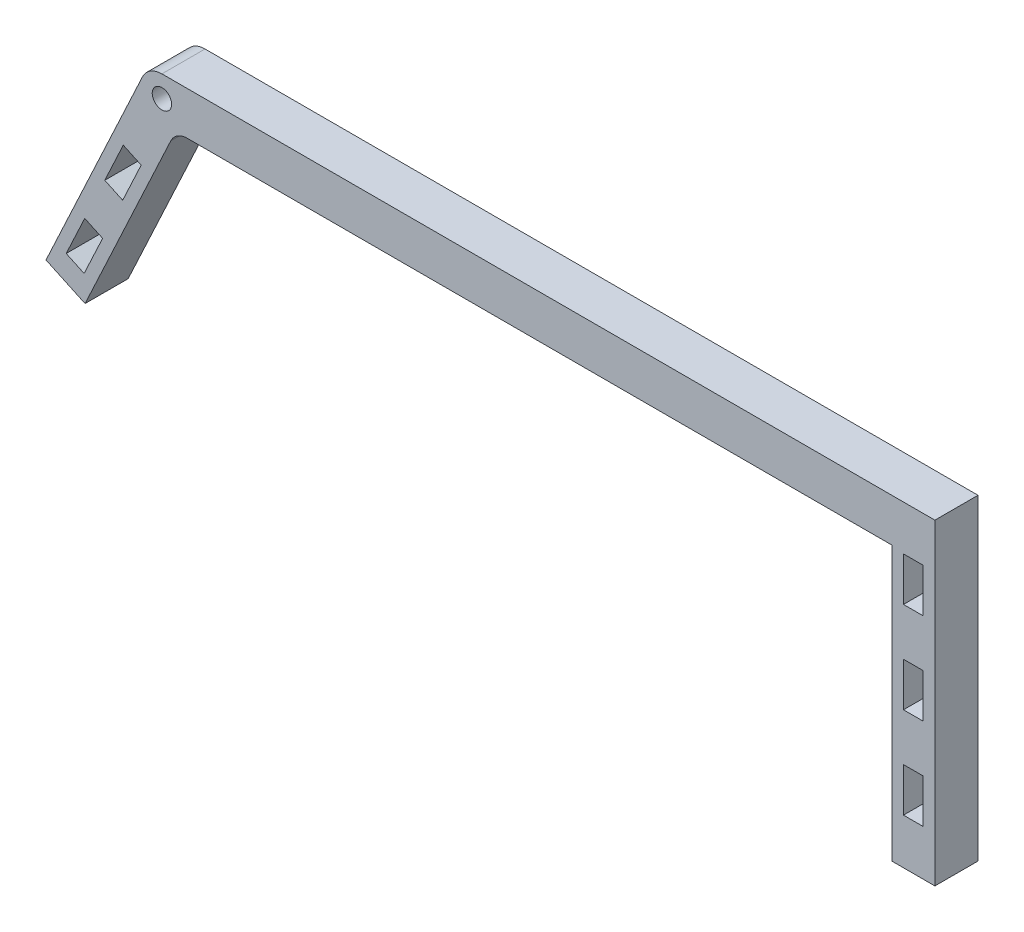
ISO-10303-21;
HEADER;
FILE_DESCRIPTION(('STEP AP214'),'2;1');
FILE_NAME('part.step','',(''),(''),'','','');
FILE_SCHEMA(('AUTOMOTIVE_DESIGN { 1 0 10303 214 1 1 1 1 }'));
ENDSEC;
DATA;
#1=APPLICATION_CONTEXT('core data for automotive mechanical design processes');
#2=APPLICATION_PROTOCOL_DEFINITION('international standard','automotive_design',2000,#1);
#3=PRODUCT_CONTEXT('',#1,'mechanical');
#4=PRODUCT('Part','Part','',(#3));
#5=PRODUCT_RELATED_PRODUCT_CATEGORY('part','',(#4));
#6=PRODUCT_DEFINITION_FORMATION('','',#4);
#7=PRODUCT_DEFINITION_CONTEXT('part definition',#1,'design');
#8=PRODUCT_DEFINITION('design','',#6,#7);
#9=PRODUCT_DEFINITION_SHAPE('','',#8);
#10=(LENGTH_UNIT() NAMED_UNIT(*) SI_UNIT(.MILLI.,.METRE.));
#11=(NAMED_UNIT(*) PLANE_ANGLE_UNIT() SI_UNIT($,.RADIAN.));
#12=(NAMED_UNIT(*) SI_UNIT($,.STERADIAN.) SOLID_ANGLE_UNIT());
#13=UNCERTAINTY_MEASURE_WITH_UNIT(LENGTH_MEASURE(1.E-05),#10,'distance_accuracy_value','');
#14=(GEOMETRIC_REPRESENTATION_CONTEXT(3) GLOBAL_UNCERTAINTY_ASSIGNED_CONTEXT((#13)) GLOBAL_UNIT_ASSIGNED_CONTEXT((#10,
#11,#12)) REPRESENTATION_CONTEXT('',''));
#15=CARTESIAN_POINT('',(0.,0.,0.));
#16=DIRECTION('',(0.,0.,1.));
#17=DIRECTION('',(1.,0.,0.));
#18=AXIS2_PLACEMENT_3D('',#15,#16,#17);
#19=CARTESIAN_POINT('',(50.925,-9.34999999999999,-3.));
#20=DIRECTION('',(0.,-1.,0.));
#21=DIRECTION('',(0.,0.,-1.));
#22=AXIS2_PLACEMENT_3D('',#19,#20,#21);
#23=PLANE('',#22);
#24=DIRECTION('',(1.,0.,0.));
#25=VECTOR('',#24,1.);
#26=CARTESIAN_POINT('',(0.,-9.34999999999999,3.));
#27=LINE('',#26,#25);
#28=CARTESIAN_POINT('',(50.925,-9.34999999999999,3.));
#29=VERTEX_POINT('',#28);
#30=CARTESIAN_POINT('',(53.675,-9.34999999999999,3.));
#31=VERTEX_POINT('',#30);
#32=EDGE_CURVE('E469',#29,#31,#27,.T.);
#33=ORIENTED_EDGE('',*,*,#32,.T.);
#34=DIRECTION('',(0.,0.,1.));
#35=VECTOR('',#34,1.);
#36=CARTESIAN_POINT('',(53.675,-9.34999999999999,-3.));
#37=LINE('',#36,#35);
#38=CARTESIAN_POINT('',(53.675,-9.34999999999999,-3.));
#39=VERTEX_POINT('',#38);
#40=EDGE_CURVE('E11',#39,#31,#37,.T.);
#41=ORIENTED_EDGE('',*,*,#40,.F.);
#42=DIRECTION('',(1.,0.,0.));
#43=VECTOR('',#42,1.);
#44=CARTESIAN_POINT('',(50.925,-9.34999999999999,-3.));
#45=LINE('',#44,#43);
#46=CARTESIAN_POINT('',(50.925,-9.34999999999999,-3.));
#47=VERTEX_POINT('',#46);
#48=EDGE_CURVE('E473',#47,#39,#45,.T.);
#49=ORIENTED_EDGE('',*,*,#48,.F.);
#50=DIRECTION('',(0.,0.,1.));
#51=VECTOR('',#50,1.);
#52=CARTESIAN_POINT('',(50.925,-9.34999999999999,-3.));
#53=LINE('',#52,#51);
#54=EDGE_CURVE('E478',#47,#29,#53,.T.);
#55=ORIENTED_EDGE('',*,*,#54,.T.);
#56=EDGE_LOOP('',(#33,#41,#49,#55));
#57=FACE_BOUND('',#56,.T.);
#58=ADVANCED_FACE('F45',(#57),#23,.F.);
#59=CARTESIAN_POINT('',(53.675,-3.25399999999999,-3.));
#60=DIRECTION('',(1.,0.,0.));
#61=DIRECTION('',(0.,0.,-1.));
#62=AXIS2_PLACEMENT_3D('',#59,#60,#61);
#63=PLANE('',#62);
#64=DIRECTION('',(0.,1.,0.));
#65=VECTOR('',#64,1.);
#66=CARTESIAN_POINT('',(53.675,25.4,3.));
#67=LINE('',#66,#65);
#68=CARTESIAN_POINT('',(53.675,-3.25399999999999,3.));
#69=VERTEX_POINT('',#68);
#70=EDGE_CURVE('E466',#31,#69,#67,.T.);
#71=ORIENTED_EDGE('',*,*,#70,.T.);
#72=DIRECTION('',(0.,0.,1.));
#73=VECTOR('',#72,1.);
#74=CARTESIAN_POINT('',(53.675,-3.25399999999999,-3.));
#75=LINE('',#74,#73);
#76=CARTESIAN_POINT('',(53.675,-3.25399999999999,-3.));
#77=VERTEX_POINT('',#76);
#78=EDGE_CURVE('E52',#77,#69,#75,.T.);
#79=ORIENTED_EDGE('',*,*,#78,.F.);
#80=DIRECTION('',(0.,1.,0.));
#81=VECTOR('',#80,1.);
#82=CARTESIAN_POINT('',(53.675,-3.25399999999999,-3.));
#83=LINE('',#82,#81);
#84=EDGE_CURVE('E66',#39,#77,#83,.T.);
#85=ORIENTED_EDGE('',*,*,#84,.F.);
#86=ORIENTED_EDGE('',*,*,#40,.T.);
#87=EDGE_LOOP('',(#71,#79,#85,#86));
#88=FACE_BOUND('',#87,.T.);
#89=ADVANCED_FACE('F488',(#88),#63,.F.);
#90=CARTESIAN_POINT('',(50.925,-3.25399999999999,-3.));
#91=DIRECTION('',(0.,1.,0.));
#92=DIRECTION('',(0.,0.,1.));
#93=AXIS2_PLACEMENT_3D('',#90,#91,#92);
#94=PLANE('',#93);
#95=DIRECTION('',(-1.,0.,0.));
#96=VECTOR('',#95,1.);
#97=CARTESIAN_POINT('',(0.,-3.25399999999999,3.));
#98=LINE('',#97,#96);
#99=CARTESIAN_POINT('',(50.925,-3.25399999999999,3.));
#100=VERTEX_POINT('',#99);
#101=EDGE_CURVE('E463',#69,#100,#98,.T.);
#102=ORIENTED_EDGE('',*,*,#101,.T.);
#103=DIRECTION('',(0.,0.,1.));
#104=VECTOR('',#103,1.);
#105=CARTESIAN_POINT('',(50.925,-3.25399999999999,-3.));
#106=LINE('',#105,#104);
#107=CARTESIAN_POINT('',(50.925,-3.25399999999999,-3.));
#108=VERTEX_POINT('',#107);
#109=EDGE_CURVE('E481',#108,#100,#106,.T.);
#110=ORIENTED_EDGE('',*,*,#109,.F.);
#111=DIRECTION('',(-1.,0.,0.));
#112=VECTOR('',#111,1.);
#113=CARTESIAN_POINT('',(50.925,-3.25399999999999,-3.));
#114=LINE('',#113,#112);
#115=EDGE_CURVE('E476',#77,#108,#114,.T.);
#116=ORIENTED_EDGE('',*,*,#115,.F.);
#117=ORIENTED_EDGE('',*,*,#78,.T.);
#118=EDGE_LOOP('',(#102,#110,#116,#117));
#119=FACE_BOUND('',#118,.T.);
#120=ADVANCED_FACE('F485',(#119),#94,.F.);
#121=CARTESIAN_POINT('',(50.925,-3.25399999999999,-3.));
#122=DIRECTION('',(-1.,0.,0.));
#123=DIRECTION('',(0.,0.,1.));
#124=AXIS2_PLACEMENT_3D('',#121,#122,#123);
#125=PLANE('',#124);
#126=DIRECTION('',(0.,-1.,0.));
#127=VECTOR('',#126,1.);
#128=CARTESIAN_POINT('',(50.925,25.4,3.));
#129=LINE('',#128,#127);
#130=EDGE_CURVE('E461',#100,#29,#129,.T.);
#131=ORIENTED_EDGE('',*,*,#130,.T.);
#132=ORIENTED_EDGE('',*,*,#54,.F.);
#133=DIRECTION('',(0.,-1.,0.));
#134=VECTOR('',#133,1.);
#135=CARTESIAN_POINT('',(50.925,-3.25399999999999,-3.));
#136=LINE('',#135,#134);
#137=EDGE_CURVE('E59',#108,#47,#136,.T.);
#138=ORIENTED_EDGE('',*,*,#137,.F.);
#139=ORIENTED_EDGE('',*,*,#109,.T.);
#140=EDGE_LOOP('',(#131,#132,#138,#139));
#141=FACE_BOUND('',#140,.T.);
#142=ADVANCED_FACE('F494',(#141),#125,.F.);
#143=CARTESIAN_POINT('',(0.,3.,3.));
#144=DIRECTION('',(0.,1.,0.));
#145=DIRECTION('',(-1.,0.,0.));
#146=AXIS2_PLACEMENT_3D('',#143,#144,#145);
#147=PLANE('',#146);
#148=DIRECTION('',(1.,0.,0.));
#149=VECTOR('',#148,1.);
#150=CARTESIAN_POINT('',(0.,3.,-3.));
#151=LINE('',#150,#149);
#152=CARTESIAN_POINT('',(-52.3,3.,-3.));
#153=VERTEX_POINT('',#152);
#154=CARTESIAN_POINT('',(55.3,3.,-3.));
#155=VERTEX_POINT('',#154);
#156=EDGE_CURVE('E411',#153,#155,#151,.T.);
#157=ORIENTED_EDGE('',*,*,#156,.F.);
#158=DIRECTION('',(0.,0.,-1.));
#159=VECTOR('',#158,1.);
#160=CARTESIAN_POINT('',(-52.3,3.,3.));
#161=LINE('',#160,#159);
#162=CARTESIAN_POINT('',(-52.3,3.,3.));
#163=VERTEX_POINT('',#162);
#164=EDGE_CURVE('E450',#163,#153,#161,.T.);
#165=ORIENTED_EDGE('',*,*,#164,.F.);
#166=DIRECTION('',(1.,0.,0.));
#167=VECTOR('',#166,1.);
#168=CARTESIAN_POINT('',(0.,3.,3.));
#169=LINE('',#168,#167);
#170=CARTESIAN_POINT('',(55.3,3.,3.));
#171=VERTEX_POINT('',#170);
#172=EDGE_CURVE('E384',#163,#171,#169,.T.);
#173=ORIENTED_EDGE('',*,*,#172,.T.);
#174=DIRECTION('',(0.,0.,-1.));
#175=VECTOR('',#174,1.);
#176=CARTESIAN_POINT('',(55.3,3.,3.));
#177=LINE('',#176,#175);
#178=EDGE_CURVE('E408',#171,#155,#177,.T.);
#179=ORIENTED_EDGE('',*,*,#178,.T.);
#180=EDGE_LOOP('',(#157,#165,#173,#179));
#181=FACE_BOUND('',#180,.T.);
#182=ADVANCED_FACE('F496',(#181),#147,.T.);
#183=CARTESIAN_POINT('',(-52.3,0.,3.));
#184=DIRECTION('',(0.,0.,-1.));
#185=DIRECTION('',(-1.,0.,0.));
#186=AXIS2_PLACEMENT_3D('',#183,#184,#185);
#187=CYLINDRICAL_SURFACE('',#186,2.99999999999999);
#188=CARTESIAN_POINT('',(-52.3,0.,-3.));
#189=DIRECTION('',(0.,0.,1.));
#190=DIRECTION('',(1.,0.,0.));
#191=AXIS2_PLACEMENT_3D('',#188,#189,#190);
#192=CIRCLE('',#191,2.99999999999999);
#193=CARTESIAN_POINT('',(-55.0189233611099,1.26785478522211,-3.));
#194=VERTEX_POINT('',#193);
#195=EDGE_CURVE('E414',#153,#194,#192,.T.);
#196=ORIENTED_EDGE('',*,*,#195,.T.);
#197=DIRECTION('',(0.,0.,-1.));
#198=VECTOR('',#197,1.);
#199=CARTESIAN_POINT('',(-55.0189233611099,1.26785478522211,3.));
#200=LINE('',#199,#198);
#201=CARTESIAN_POINT('',(-55.0189233611099,1.26785478522211,3.));
#202=VERTEX_POINT('',#201);
#203=EDGE_CURVE('E448',#202,#194,#200,.T.);
#204=ORIENTED_EDGE('',*,*,#203,.F.);
#205=CARTESIAN_POINT('',(-52.3,0.,3.));
#206=DIRECTION('',(0.,0.,1.));
#207=DIRECTION('',(1.,0.,0.));
#208=AXIS2_PLACEMENT_3D('',#205,#206,#207);
#209=CIRCLE('',#208,2.99999999999999);
#210=EDGE_CURVE('E388',#163,#202,#209,.T.);
#211=ORIENTED_EDGE('',*,*,#210,.F.);
#212=ORIENTED_EDGE('',*,*,#164,.T.);
#213=EDGE_LOOP('',(#196,#204,#211,#212));
#214=FACE_BOUND('',#213,.T.);
#215=ADVANCED_FACE('F503',(#214),#187,.T.);
#216=CARTESIAN_POINT('',(-45.6778193544113,21.2999169727848,3.));
#217=DIRECTION('',(-0.906307787036633,0.422618261740735,0.));
#218=DIRECTION('',(-0.422618261740735,-0.906307787036634,0.));
#219=AXIS2_PLACEMENT_3D('',#216,#217,#218);
#220=PLANE('',#219);
#221=DIRECTION('',(0.422618261740735,0.906307787036634,0.));
#222=VECTOR('',#221,1.);
#223=CARTESIAN_POINT('',(-45.6778193544113,21.2999169727848,-3.));
#224=LINE('',#223,#222);
#225=CARTESIAN_POINT('',(-68.4370531713773,-27.5074174531915,-3.));
#226=VERTEX_POINT('',#225);
#227=EDGE_CURVE('E417',#226,#194,#224,.T.);
#228=ORIENTED_EDGE('',*,*,#227,.F.);
#229=DIRECTION('',(0.,0.,-1.));
#230=VECTOR('',#229,1.);
#231=CARTESIAN_POINT('',(-68.4370531713773,-27.5074174531915,3.));
#232=LINE('',#231,#230);
#233=CARTESIAN_POINT('',(-68.4370531713773,-27.5074174531915,3.));
#234=VERTEX_POINT('',#233);
#235=EDGE_CURVE('E446',#234,#226,#232,.T.);
#236=ORIENTED_EDGE('',*,*,#235,.F.);
#237=DIRECTION('',(0.422618261740735,0.906307787036634,0.));
#238=VECTOR('',#237,1.);
#239=CARTESIAN_POINT('',(-45.6778193544113,21.2999169727848,3.));
#240=LINE('',#239,#238);
#241=EDGE_CURVE('E390',#234,#202,#240,.T.);
#242=ORIENTED_EDGE('',*,*,#241,.T.);
#243=ORIENTED_EDGE('',*,*,#203,.T.);
#244=EDGE_LOOP('',(#228,#236,#242,#243));
#245=FACE_BOUND('',#244,.T.);
#246=ADVANCED_FACE('F643',(#245),#220,.T.);
#247=CARTESIAN_POINT('',(-22.7592338169645,-48.807334425975,3.));
#248=DIRECTION('',(0.422618261740704,0.906307787036648,0.));
#249=DIRECTION('',(-0.906307787036648,0.422618261740704,0.));
#250=AXIS2_PLACEMENT_3D('',#247,#248,#249);
#251=PLANE('',#250);
#252=DIRECTION('',(0.906307787036648,-0.422618261740704,0.));
#253=VECTOR('',#252,1.);
#254=CARTESIAN_POINT('',(-22.7592338169645,-48.807334425975,-3.));
#255=LINE('',#254,#253);
#256=CARTESIAN_POINT('',(-62.9992064491574,-30.0431270236357,-3.));
#257=VERTEX_POINT('',#256);
#258=EDGE_CURVE('E420',#226,#257,#255,.T.);
#259=ORIENTED_EDGE('',*,*,#258,.T.);
#260=DIRECTION('',(0.,0.,-1.));
#261=VECTOR('',#260,1.);
#262=CARTESIAN_POINT('',(-62.9992064491574,-30.0431270236357,3.));
#263=LINE('',#262,#261);
#264=CARTESIAN_POINT('',(-62.9992064491574,-30.0431270236357,3.));
#265=VERTEX_POINT('',#264);
#266=EDGE_CURVE('E443',#265,#257,#263,.T.);
#267=ORIENTED_EDGE('',*,*,#266,.F.);
#268=DIRECTION('',(0.906307787036648,-0.422618261740704,0.));
#269=VECTOR('',#268,1.);
#270=CARTESIAN_POINT('',(-22.7592338169645,-48.807334425975,3.));
#271=LINE('',#270,#269);
#272=EDGE_CURVE('E393',#234,#265,#271,.T.);
#273=ORIENTED_EDGE('',*,*,#272,.F.);
#274=ORIENTED_EDGE('',*,*,#235,.T.);
#275=EDGE_LOOP('',(#259,#267,#273,#274));
#276=FACE_BOUND('',#275,.T.);
#277=ADVANCED_FACE('F639',(#276),#251,.F.);
#278=CARTESIAN_POINT('',(-40.2399726321929,18.7642074023393,3.));
#279=DIRECTION('',(0.906307787036648,-0.422618261740703,0.));
#280=DIRECTION('',(0.422618261740703,0.906307787036648,0.));
#281=AXIS2_PLACEMENT_3D('',#278,#279,#280);
#282=PLANE('',#281);
#283=DIRECTION('',(-0.422618261740703,-0.906307787036648,0.));
#284=VECTOR('',#283,1.);
#285=CARTESIAN_POINT('',(-40.2399726321929,18.7642074023393,-3.));
#286=LINE('',#285,#284);
#287=CARTESIAN_POINT('',(-51.0726525341996,-4.46654961517861,-3.));
#288=VERTEX_POINT('',#287);
#289=EDGE_CURVE('E423',#288,#257,#286,.T.);
#290=ORIENTED_EDGE('',*,*,#289,.F.);
#291=DIRECTION('',(0.,0.,-1.));
#292=VECTOR('',#291,1.);
#293=CARTESIAN_POINT('',(-51.0726525341996,-4.46654961517861,3.));
#294=LINE('',#293,#292);
#295=CARTESIAN_POINT('',(-51.0726525341996,-4.46654961517861,3.));
#296=VERTEX_POINT('',#295);
#297=EDGE_CURVE('E455',#288,#296,#294,.F.);
#298=ORIENTED_EDGE('',*,*,#297,.T.);
#299=DIRECTION('',(-0.422618261740703,-0.906307787036648,0.));
#300=VECTOR('',#299,1.);
#301=CARTESIAN_POINT('',(-40.2399726321929,18.7642074023393,3.));
#302=LINE('',#301,#300);
#303=EDGE_CURVE('E396',#296,#265,#302,.T.);
#304=ORIENTED_EDGE('',*,*,#303,.T.);
#305=ORIENTED_EDGE('',*,*,#266,.T.);
#306=EDGE_LOOP('',(#290,#298,#304,#305));
#307=FACE_BOUND('',#306,.T.);
#308=ADVANCED_FACE('F635',(#307),#282,.T.);
#309=CARTESIAN_POINT('',(0.,-3.,3.));
#310=DIRECTION('',(0.,1.,0.));
#311=DIRECTION('',(0.,0.,1.));
#312=AXIS2_PLACEMENT_3D('',#309,#310,#311);
#313=PLANE('',#312);
#314=DIRECTION('',(1.,0.,0.));
#315=VECTOR('',#314,1.);
#316=CARTESIAN_POINT('',(0.,-3.,3.));
#317=LINE('',#316,#315);
#318=CARTESIAN_POINT('',(-48.7706307551265,-3.,3.));
#319=VERTEX_POINT('',#318);
#320=CARTESIAN_POINT('',(49.3,-3.,3.));
#321=VERTEX_POINT('',#320);
#322=EDGE_CURVE('E398',#319,#321,#317,.T.);
#323=ORIENTED_EDGE('',*,*,#322,.F.);
#324=DIRECTION('',(0.,0.,-1.));
#325=VECTOR('',#324,1.);
#326=CARTESIAN_POINT('',(-48.7706307551265,-3.,3.));
#327=LINE('',#326,#325);
#328=CARTESIAN_POINT('',(-48.7706307551265,-3.,-3.));
#329=VERTEX_POINT('',#328);
#330=EDGE_CURVE('E452',#319,#329,#327,.T.);
#331=ORIENTED_EDGE('',*,*,#330,.T.);
#332=DIRECTION('',(1.,0.,0.));
#333=VECTOR('',#332,1.);
#334=CARTESIAN_POINT('',(0.,-3.,-3.));
#335=LINE('',#334,#333);
#336=CARTESIAN_POINT('',(49.3,-3.,-3.));
#337=VERTEX_POINT('',#336);
#338=EDGE_CURVE('E425',#329,#337,#335,.T.);
#339=ORIENTED_EDGE('',*,*,#338,.T.);
#340=DIRECTION('',(0.,0.,-1.));
#341=VECTOR('',#340,1.);
#342=CARTESIAN_POINT('',(49.3,-3.,3.));
#343=LINE('',#342,#341);
#344=EDGE_CURVE('E440',#321,#337,#343,.T.);
#345=ORIENTED_EDGE('',*,*,#344,.F.);
#346=EDGE_LOOP('',(#323,#331,#339,#345));
#347=FACE_BOUND('',#346,.T.);
#348=ADVANCED_FACE('F631',(#347),#313,.F.);
#349=CARTESIAN_POINT('',(49.3,0.,3.));
#350=DIRECTION('',(1.,0.,0.));
#351=DIRECTION('',(0.,1.,0.));
#352=AXIS2_PLACEMENT_3D('',#349,#350,#351);
#353=PLANE('',#352);
#354=DIRECTION('',(0.,-1.,0.));
#355=VECTOR('',#354,1.);
#356=CARTESIAN_POINT('',(49.3,0.,-3.));
#357=LINE('',#356,#355);
#358=CARTESIAN_POINT('',(49.3,-41.1,-3.));
#359=VERTEX_POINT('',#358);
#360=EDGE_CURVE('E427',#337,#359,#357,.T.);
#361=ORIENTED_EDGE('',*,*,#360,.T.);
#362=DIRECTION('',(0.,0.,-1.));
#363=VECTOR('',#362,1.);
#364=CARTESIAN_POINT('',(49.3,-41.1,3.));
#365=LINE('',#364,#363);
#366=CARTESIAN_POINT('',(49.3,-41.1,3.));
#367=VERTEX_POINT('',#366);
#368=EDGE_CURVE('E438',#367,#359,#365,.T.);
#369=ORIENTED_EDGE('',*,*,#368,.F.);
#370=DIRECTION('',(0.,-1.,0.));
#371=VECTOR('',#370,1.);
#372=CARTESIAN_POINT('',(49.3,0.,3.));
#373=LINE('',#372,#371);
#374=EDGE_CURVE('E400',#321,#367,#373,.T.);
#375=ORIENTED_EDGE('',*,*,#374,.F.);
#376=ORIENTED_EDGE('',*,*,#344,.T.);
#377=EDGE_LOOP('',(#361,#369,#375,#376));
#378=FACE_BOUND('',#377,.T.);
#379=ADVANCED_FACE('F627',(#378),#353,.F.);
#380=CARTESIAN_POINT('',(0.,-41.1,3.));
#381=DIRECTION('',(0.,-1.,0.));
#382=DIRECTION('',(0.,0.,-1.));
#383=AXIS2_PLACEMENT_3D('',#380,#381,#382);
#384=PLANE('',#383);
#385=DIRECTION('',(-1.,0.,0.));
#386=VECTOR('',#385,1.);
#387=CARTESIAN_POINT('',(0.,-41.1,-3.));
#388=LINE('',#387,#386);
#389=CARTESIAN_POINT('',(55.3,-41.1,-3.));
#390=VERTEX_POINT('',#389);
#391=EDGE_CURVE('E430',#390,#359,#388,.T.);
#392=ORIENTED_EDGE('',*,*,#391,.F.);
#393=DIRECTION('',(0.,0.,-1.));
#394=VECTOR('',#393,1.);
#395=CARTESIAN_POINT('',(55.3,-41.1,3.));
#396=LINE('',#395,#394);
#397=CARTESIAN_POINT('',(55.3,-41.1,3.));
#398=VERTEX_POINT('',#397);
#399=EDGE_CURVE('E436',#398,#390,#396,.T.);
#400=ORIENTED_EDGE('',*,*,#399,.F.);
#401=DIRECTION('',(-1.,0.,0.));
#402=VECTOR('',#401,1.);
#403=CARTESIAN_POINT('',(0.,-41.1,3.));
#404=LINE('',#403,#402);
#405=EDGE_CURVE('E402',#398,#367,#404,.T.);
#406=ORIENTED_EDGE('',*,*,#405,.T.);
#407=ORIENTED_EDGE('',*,*,#368,.T.);
#408=EDGE_LOOP('',(#392,#400,#406,#407));
#409=FACE_BOUND('',#408,.T.);
#410=ADVANCED_FACE('F624',(#409),#384,.T.);
#411=CARTESIAN_POINT('',(-52.3,0.,3.));
#412=DIRECTION('',(0.,0.,-1.));
#413=DIRECTION('',(-1.,0.,0.));
#414=AXIS2_PLACEMENT_3D('',#411,#412,#413);
#415=CYLINDRICAL_SURFACE('',#414,1.35);
#416=CARTESIAN_POINT('',(-52.3,0.,3.));
#417=DIRECTION('',(0.,0.,1.));
#418=DIRECTION('',(1.,0.,0.));
#419=AXIS2_PLACEMENT_3D('',#416,#417,#418);
#420=CIRCLE('',#419,1.35);
#421=CARTESIAN_POINT('',(-50.95,0.,3.));
#422=VERTEX_POINT('',#421);
#423=EDGE_CURVE('E381',#422,#422,#420,.T.);
#424=ORIENTED_EDGE('',*,*,#423,.T.);
#425=EDGE_LOOP('',(#424));
#426=FACE_BOUND('',#425,.T.);
#427=CARTESIAN_POINT('',(-52.3,0.,-3.));
#428=DIRECTION('',(0.,0.,1.));
#429=DIRECTION('',(1.,0.,0.));
#430=AXIS2_PLACEMENT_3D('',#427,#428,#429);
#431=CIRCLE('',#430,1.35);
#432=CARTESIAN_POINT('',(-50.95,0.,-3.));
#433=VERTEX_POINT('',#432);
#434=EDGE_CURVE('E380',#433,#433,#431,.T.);
#435=ORIENTED_EDGE('',*,*,#434,.F.);
#436=EDGE_LOOP('',(#435));
#437=FACE_BOUND('',#436,.T.);
#438=ADVANCED_FACE('F622',(#426,#437),#415,.F.);
#439=CARTESIAN_POINT('',(55.3,0.,3.));
#440=DIRECTION('',(1.,0.,0.));
#441=DIRECTION('',(0.,1.,0.));
#442=AXIS2_PLACEMENT_3D('',#439,#440,#441);
#443=PLANE('',#442);
#444=DIRECTION('',(0.,-1.,0.));
#445=VECTOR('',#444,1.);
#446=CARTESIAN_POINT('',(55.3,0.,-3.));
#447=LINE('',#446,#445);
#448=EDGE_CURVE('E385',#155,#390,#447,.T.);
#449=ORIENTED_EDGE('',*,*,#448,.F.);
#450=ORIENTED_EDGE('',*,*,#178,.F.);
#451=DIRECTION('',(0.,-1.,0.));
#452=VECTOR('',#451,1.);
#453=CARTESIAN_POINT('',(55.3,0.,3.));
#454=LINE('',#453,#452);
#455=EDGE_CURVE('E405',#171,#398,#454,.T.);
#456=ORIENTED_EDGE('',*,*,#455,.T.);
#457=ORIENTED_EDGE('',*,*,#399,.T.);
#458=EDGE_LOOP('',(#449,#450,#456,#457));
#459=FACE_BOUND('',#458,.T.);
#460=ADVANCED_FACE('F617',(#459),#443,.T.);
#461=CARTESIAN_POINT('',(0.,0.,3.));
#462=DIRECTION('',(0.,0.,1.));
#463=DIRECTION('',(1.,0.,0.));
#464=AXIS2_PLACEMENT_3D('',#461,#462,#463);
#465=PLANE('',#464);
#466=DIRECTION('',(0.,-1.,0.));
#467=VECTOR('',#466,1.);
#468=CARTESIAN_POINT('',(50.925,12.7,3.));
#469=LINE('',#468,#467);
#470=CARTESIAN_POINT('',(50.925,-15.954,3.));
#471=VERTEX_POINT('',#470);
#472=CARTESIAN_POINT('',(50.925,-22.05,3.));
#473=VERTEX_POINT('',#472);
#474=EDGE_CURVE('E279',#471,#473,#469,.T.);
#475=ORIENTED_EDGE('',*,*,#474,.F.);
#476=DIRECTION('',(-1.,0.,0.));
#477=VECTOR('',#476,1.);
#478=CARTESIAN_POINT('',(0.,-15.954,3.));
#479=LINE('',#478,#477);
#480=CARTESIAN_POINT('',(53.675,-15.954,3.));
#481=VERTEX_POINT('',#480);
#482=EDGE_CURVE('E265',#481,#471,#479,.T.);
#483=ORIENTED_EDGE('',*,*,#482,.F.);
#484=DIRECTION('',(0.,1.,0.));
#485=VECTOR('',#484,1.);
#486=CARTESIAN_POINT('',(53.675,12.7,3.));
#487=LINE('',#486,#485);
#488=CARTESIAN_POINT('',(53.675,-22.05,3.));
#489=VERTEX_POINT('',#488);
#490=EDGE_CURVE('E257',#489,#481,#487,.T.);
#491=ORIENTED_EDGE('',*,*,#490,.F.);
#492=DIRECTION('',(1.,0.,0.));
#493=VECTOR('',#492,1.);
#494=CARTESIAN_POINT('',(0.,-22.05,3.));
#495=LINE('',#494,#493);
#496=EDGE_CURVE('E243',#473,#489,#495,.T.);
#497=ORIENTED_EDGE('',*,*,#496,.F.);
#498=EDGE_LOOP('',(#475,#483,#491,#497));
#499=FACE_BOUND('',#498,.T.);
#500=DIRECTION('',(0.,-1.,0.));
#501=VECTOR('',#500,1.);
#502=CARTESIAN_POINT('',(50.925,0.,3.));
#503=LINE('',#502,#501);
#504=CARTESIAN_POINT('',(50.925,-28.654,3.));
#505=VERTEX_POINT('',#504);
#506=CARTESIAN_POINT('',(50.925,-34.75,3.));
#507=VERTEX_POINT('',#506);
#508=EDGE_CURVE('E313',#505,#507,#503,.T.);
#509=ORIENTED_EDGE('',*,*,#508,.F.);
#510=DIRECTION('',(-1.,0.,0.));
#511=VECTOR('',#510,1.);
#512=CARTESIAN_POINT('',(0.,-28.654,3.));
#513=LINE('',#512,#511);
#514=CARTESIAN_POINT('',(53.675,-28.654,3.));
#515=VERTEX_POINT('',#514);
#516=EDGE_CURVE('E311',#515,#505,#513,.T.);
#517=ORIENTED_EDGE('',*,*,#516,.F.);
#518=DIRECTION('',(0.,1.,0.));
#519=VECTOR('',#518,1.);
#520=CARTESIAN_POINT('',(53.675,0.,3.));
#521=LINE('',#520,#519);
#522=CARTESIAN_POINT('',(53.675,-34.75,3.));
#523=VERTEX_POINT('',#522);
#524=EDGE_CURVE('E309',#523,#515,#521,.T.);
#525=ORIENTED_EDGE('',*,*,#524,.F.);
#526=DIRECTION('',(1.,0.,0.));
#527=VECTOR('',#526,1.);
#528=CARTESIAN_POINT('',(0.,-34.75,3.));
#529=LINE('',#528,#527);
#530=EDGE_CURVE('E300',#507,#523,#529,.T.);
#531=ORIENTED_EDGE('',*,*,#530,.F.);
#532=EDGE_LOOP('',(#509,#517,#525,#531));
#533=FACE_BOUND('',#532,.T.);
#534=DIRECTION('',(-0.906307787036647,0.422618261740706,0.));
#535=VECTOR('',#534,1.);
#536=CARTESIAN_POINT('',(-13.4738879882597,-28.8948460369929,3.));
#537=LINE('',#536,#535);
#538=CARTESIAN_POINT('',(-55.1866107743869,-9.44388395932487,3.));
#539=VERTEX_POINT('',#538);
#540=CARTESIAN_POINT('',(-57.6789571887377,-8.28168373953793,3.));
#541=VERTEX_POINT('',#540);
#542=EDGE_CURVE('E345',#539,#541,#537,.T.);
#543=ORIENTED_EDGE('',*,*,#542,.F.);
#544=DIRECTION('',(0.422618261740701,0.906307787036649,0.));
#545=VECTOR('',#544,1.);
#546=CARTESIAN_POINT('',(-41.7127227861276,19.4509620776679,3.));
#547=LINE('',#546,#545);
#548=CARTESIAN_POINT('',(-57.7628916979583,-14.9687362291003,3.));
#549=VERTEX_POINT('',#548);
#550=EDGE_CURVE('E343',#549,#539,#547,.T.);
#551=ORIENTED_EDGE('',*,*,#550,.F.);
#552=DIRECTION('',(0.906307787036648,-0.422618261740703,0.));
#553=VECTOR('',#552,1.);
#554=CARTESIAN_POINT('',(-16.0501689118308,-34.4196983067682,3.));
#555=LINE('',#554,#553);
#556=CARTESIAN_POINT('',(-60.255238112309,-13.8065360093133,3.));
#557=VERTEX_POINT('',#556);
#558=EDGE_CURVE('E341',#557,#549,#555,.T.);
#559=ORIENTED_EDGE('',*,*,#558,.F.);
#560=DIRECTION('',(-0.422618261740704,-0.906307787036648,0.));
#561=VECTOR('',#560,1.);
#562=CARTESIAN_POINT('',(-44.2050692004782,20.6131622974549,3.));
#563=LINE('',#562,#561);
#564=EDGE_CURVE('E332',#541,#557,#563,.T.);
#565=ORIENTED_EDGE('',*,*,#564,.F.);
#566=EDGE_LOOP('',(#543,#551,#559,#565));
#567=FACE_BOUND('',#566,.T.);
#568=DIRECTION('',(-0.906307787036647,0.422618261740706,0.));
#569=VECTOR('',#568,1.);
#570=CARTESIAN_POINT('',(-18.8411399123666,-40.4049549323583,3.));
#571=LINE('',#570,#569);
#572=CARTESIAN_POINT('',(-60.5538626984939,-20.9539928546903,3.));
#573=VERTEX_POINT('',#572);
#574=CARTESIAN_POINT('',(-63.0462091128447,-19.7917926349034,3.));
#575=VERTEX_POINT('',#574);
#576=EDGE_CURVE('E377',#573,#575,#571,.T.);
#577=ORIENTED_EDGE('',*,*,#576,.F.);
#578=DIRECTION('',(0.422618261740701,0.906307787036649,0.));
#579=VECTOR('',#578,1.);
#580=CARTESIAN_POINT('',(-41.7127227861276,19.4509620776679,3.));
#581=LINE('',#580,#579);
#582=CARTESIAN_POINT('',(-63.1301436220652,-26.4788451244657,3.));
#583=VERTEX_POINT('',#582);
#584=EDGE_CURVE('E375',#583,#573,#581,.T.);
#585=ORIENTED_EDGE('',*,*,#584,.F.);
#586=DIRECTION('',(0.906307787036648,-0.422618261740703,0.));
#587=VECTOR('',#586,1.);
#588=CARTESIAN_POINT('',(-21.4174208359378,-45.9298072021336,3.));
#589=LINE('',#588,#587);
#590=CARTESIAN_POINT('',(-65.622490036416,-25.3166449046788,3.));
#591=VERTEX_POINT('',#590);
#592=EDGE_CURVE('E373',#591,#583,#589,.T.);
#593=ORIENTED_EDGE('',*,*,#592,.F.);
#594=DIRECTION('',(-0.422618261740704,-0.906307787036648,0.));
#595=VECTOR('',#594,1.);
#596=CARTESIAN_POINT('',(-44.2050692004782,20.6131622974549,3.));
#597=LINE('',#596,#595);
#598=EDGE_CURVE('E364',#575,#591,#597,.T.);
#599=ORIENTED_EDGE('',*,*,#598,.F.);
#600=EDGE_LOOP('',(#577,#585,#593,#599));
#601=FACE_BOUND('',#600,.T.);
#602=ORIENTED_EDGE('',*,*,#423,.F.);
#603=EDGE_LOOP('',(#602));
#604=FACE_BOUND('',#603,.T.);
#605=ORIENTED_EDGE('',*,*,#172,.F.);
#606=ORIENTED_EDGE('',*,*,#210,.T.);
#607=ORIENTED_EDGE('',*,*,#241,.F.);
#608=ORIENTED_EDGE('',*,*,#272,.T.);
#609=ORIENTED_EDGE('',*,*,#303,.F.);
#610=CARTESIAN_POINT('',(-48.7706307551265,-5.54,3.));
#611=DIRECTION('',(0.,0.,1.));
#612=DIRECTION('',(1.,0.,0.));
#613=AXIS2_PLACEMENT_3D('',#610,#611,#612);
#614=CIRCLE('',#613,2.54);
#615=EDGE_CURVE('E459',#296,#319,#614,.F.);
#616=ORIENTED_EDGE('',*,*,#615,.T.);
#617=ORIENTED_EDGE('',*,*,#322,.T.);
#618=ORIENTED_EDGE('',*,*,#374,.T.);
#619=ORIENTED_EDGE('',*,*,#405,.F.);
#620=ORIENTED_EDGE('',*,*,#455,.F.);
#621=EDGE_LOOP('',(#605,#606,#607,#608,#609,#616,#617,#618,#619,#620));
#622=FACE_BOUND('',#621,.T.);
#623=ORIENTED_EDGE('',*,*,#130,.F.);
#624=ORIENTED_EDGE('',*,*,#101,.F.);
#625=ORIENTED_EDGE('',*,*,#70,.F.);
#626=ORIENTED_EDGE('',*,*,#32,.F.);
#627=EDGE_LOOP('',(#623,#624,#625,#626));
#628=FACE_BOUND('',#627,.T.);
#629=ADVANCED_FACE('F263',(#499,#533,#567,#601,#604,#622,#628),#465,.T.);
#630=CARTESIAN_POINT('',(0.,0.,-3.));
#631=DIRECTION('',(0.,0.,1.));
#632=DIRECTION('',(1.,0.,0.));
#633=AXIS2_PLACEMENT_3D('',#630,#631,#632);
#634=PLANE('',#633);
#635=DIRECTION('',(-1.,0.,0.));
#636=VECTOR('',#635,1.);
#637=CARTESIAN_POINT('',(50.925,-15.954,-3.));
#638=LINE('',#637,#636);
#639=CARTESIAN_POINT('',(53.675,-15.954,-3.));
#640=VERTEX_POINT('',#639);
#641=CARTESIAN_POINT('',(50.925,-15.954,-3.));
#642=VERTEX_POINT('',#641);
#643=EDGE_CURVE('E276',#640,#642,#638,.T.);
#644=ORIENTED_EDGE('',*,*,#643,.T.);
#645=DIRECTION('',(0.,-1.,0.));
#646=VECTOR('',#645,1.);
#647=CARTESIAN_POINT('',(50.925,-15.954,-3.));
#648=LINE('',#647,#646);
#649=CARTESIAN_POINT('',(50.925,-22.05,-3.));
#650=VERTEX_POINT('',#649);
#651=EDGE_CURVE('E281',#642,#650,#648,.T.);
#652=ORIENTED_EDGE('',*,*,#651,.T.);
#653=DIRECTION('',(1.,0.,0.));
#654=VECTOR('',#653,1.);
#655=CARTESIAN_POINT('',(50.925,-22.05,-3.));
#656=LINE('',#655,#654);
#657=CARTESIAN_POINT('',(53.675,-22.05,-3.));
#658=VERTEX_POINT('',#657);
#659=EDGE_CURVE('E253',#650,#658,#656,.T.);
#660=ORIENTED_EDGE('',*,*,#659,.T.);
#661=DIRECTION('',(0.,1.,0.));
#662=VECTOR('',#661,1.);
#663=CARTESIAN_POINT('',(53.675,-15.954,-3.));
#664=LINE('',#663,#662);
#665=EDGE_CURVE('E260',#658,#640,#664,.T.);
#666=ORIENTED_EDGE('',*,*,#665,.T.);
#667=EDGE_LOOP('',(#644,#652,#660,#666));
#668=FACE_BOUND('',#667,.T.);
#669=DIRECTION('',(-1.,0.,0.));
#670=VECTOR('',#669,1.);
#671=CARTESIAN_POINT('',(50.925,-28.654,-3.));
#672=LINE('',#671,#670);
#673=CARTESIAN_POINT('',(53.675,-28.654,-3.));
#674=VERTEX_POINT('',#673);
#675=CARTESIAN_POINT('',(50.925,-28.654,-3.));
#676=VERTEX_POINT('',#675);
#677=EDGE_CURVE('E293',#674,#676,#672,.T.);
#678=ORIENTED_EDGE('',*,*,#677,.T.);
#679=DIRECTION('',(0.,-1.,0.));
#680=VECTOR('',#679,1.);
#681=CARTESIAN_POINT('',(50.925,-28.654,-3.));
#682=LINE('',#681,#680);
#683=CARTESIAN_POINT('',(50.925,-34.75,-3.));
#684=VERTEX_POINT('',#683);
#685=EDGE_CURVE('E284',#676,#684,#682,.T.);
#686=ORIENTED_EDGE('',*,*,#685,.T.);
#687=DIRECTION('',(1.,0.,0.));
#688=VECTOR('',#687,1.);
#689=CARTESIAN_POINT('',(50.925,-34.75,-3.));
#690=LINE('',#689,#688);
#691=CARTESIAN_POINT('',(53.675,-34.75,-3.));
#692=VERTEX_POINT('',#691);
#693=EDGE_CURVE('E287',#684,#692,#690,.T.);
#694=ORIENTED_EDGE('',*,*,#693,.T.);
#695=DIRECTION('',(0.,1.,0.));
#696=VECTOR('',#695,1.);
#697=CARTESIAN_POINT('',(53.675,-28.654,-3.));
#698=LINE('',#697,#696);
#699=EDGE_CURVE('E290',#692,#674,#698,.T.);
#700=ORIENTED_EDGE('',*,*,#699,.T.);
#701=EDGE_LOOP('',(#678,#686,#694,#700));
#702=FACE_BOUND('',#701,.T.);
#703=DIRECTION('',(0.422618261740701,0.906307787036649,0.));
#704=VECTOR('',#703,1.);
#705=CARTESIAN_POINT('',(-55.1866107743869,-9.44388395932487,-3.));
#706=LINE('',#705,#704);
#707=CARTESIAN_POINT('',(-57.7628916979583,-14.9687362291003,-3.));
#708=VERTEX_POINT('',#707);
#709=CARTESIAN_POINT('',(-55.1866107743869,-9.44388395932487,-3.));
#710=VERTEX_POINT('',#709);
#711=EDGE_CURVE('E325',#708,#710,#706,.T.);
#712=ORIENTED_EDGE('',*,*,#711,.T.);
#713=DIRECTION('',(-0.906307787036647,0.422618261740706,0.));
#714=VECTOR('',#713,1.);
#715=CARTESIAN_POINT('',(-57.6789571887377,-8.28168373953793,-3.));
#716=LINE('',#715,#714);
#717=CARTESIAN_POINT('',(-57.6789571887377,-8.28168373953793,-3.));
#718=VERTEX_POINT('',#717);
#719=EDGE_CURVE('E316',#710,#718,#716,.T.);
#720=ORIENTED_EDGE('',*,*,#719,.T.);
#721=DIRECTION('',(-0.422618261740704,-0.906307787036648,0.));
#722=VECTOR('',#721,1.);
#723=CARTESIAN_POINT('',(-57.6789571887377,-8.28168373953793,-3.));
#724=LINE('',#723,#722);
#725=CARTESIAN_POINT('',(-60.255238112309,-13.8065360093133,-3.));
#726=VERTEX_POINT('',#725);
#727=EDGE_CURVE('E319',#718,#726,#724,.T.);
#728=ORIENTED_EDGE('',*,*,#727,.T.);
#729=DIRECTION('',(0.906307787036648,-0.422618261740703,0.));
#730=VECTOR('',#729,1.);
#731=CARTESIAN_POINT('',(-60.255238112309,-13.8065360093133,-3.));
#732=LINE('',#731,#730);
#733=EDGE_CURVE('E322',#726,#708,#732,.T.);
#734=ORIENTED_EDGE('',*,*,#733,.T.);
#735=EDGE_LOOP('',(#712,#720,#728,#734));
#736=FACE_BOUND('',#735,.T.);
#737=DIRECTION('',(0.422618261740701,0.906307787036649,0.));
#738=VECTOR('',#737,1.);
#739=CARTESIAN_POINT('',(-60.5538626984939,-20.9539928546903,-3.));
#740=LINE('',#739,#738);
#741=CARTESIAN_POINT('',(-63.1301436220652,-26.4788451244657,-3.));
#742=VERTEX_POINT('',#741);
#743=CARTESIAN_POINT('',(-60.5538626984939,-20.9539928546903,-3.));
#744=VERTEX_POINT('',#743);
#745=EDGE_CURVE('E357',#742,#744,#740,.T.);
#746=ORIENTED_EDGE('',*,*,#745,.T.);
#747=DIRECTION('',(-0.906307787036647,0.422618261740706,0.));
#748=VECTOR('',#747,1.);
#749=CARTESIAN_POINT('',(-63.0462091128447,-19.7917926349034,-3.));
#750=LINE('',#749,#748);
#751=CARTESIAN_POINT('',(-63.0462091128447,-19.7917926349034,-3.));
#752=VERTEX_POINT('',#751);
#753=EDGE_CURVE('E348',#744,#752,#750,.T.);
#754=ORIENTED_EDGE('',*,*,#753,.T.);
#755=DIRECTION('',(-0.422618261740704,-0.906307787036648,0.));
#756=VECTOR('',#755,1.);
#757=CARTESIAN_POINT('',(-63.0462091128447,-19.7917926349034,-3.));
#758=LINE('',#757,#756);
#759=CARTESIAN_POINT('',(-65.622490036416,-25.3166449046788,-3.));
#760=VERTEX_POINT('',#759);
#761=EDGE_CURVE('E351',#752,#760,#758,.T.);
#762=ORIENTED_EDGE('',*,*,#761,.T.);
#763=DIRECTION('',(0.906307787036648,-0.422618261740703,0.));
#764=VECTOR('',#763,1.);
#765=CARTESIAN_POINT('',(-65.622490036416,-25.3166449046788,-3.));
#766=LINE('',#765,#764);
#767=EDGE_CURVE('E354',#760,#742,#766,.T.);
#768=ORIENTED_EDGE('',*,*,#767,.T.);
#769=EDGE_LOOP('',(#746,#754,#762,#768));
#770=FACE_BOUND('',#769,.T.);
#771=ORIENTED_EDGE('',*,*,#434,.T.);
#772=EDGE_LOOP('',(#771));
#773=FACE_BOUND('',#772,.T.);
#774=ORIENTED_EDGE('',*,*,#156,.T.);
#775=ORIENTED_EDGE('',*,*,#448,.T.);
#776=ORIENTED_EDGE('',*,*,#391,.T.);
#777=ORIENTED_EDGE('',*,*,#360,.F.);
#778=ORIENTED_EDGE('',*,*,#338,.F.);
#779=CARTESIAN_POINT('',(-48.7706307551265,-5.54,-3.));
#780=DIRECTION('',(0.,0.,1.));
#781=DIRECTION('',(1.,0.,0.));
#782=AXIS2_PLACEMENT_3D('',#779,#780,#781);
#783=CIRCLE('',#782,2.54);
#784=EDGE_CURVE('E457',#329,#288,#783,.T.);
#785=ORIENTED_EDGE('',*,*,#784,.T.);
#786=ORIENTED_EDGE('',*,*,#289,.T.);
#787=ORIENTED_EDGE('',*,*,#258,.F.);
#788=ORIENTED_EDGE('',*,*,#227,.T.);
#789=ORIENTED_EDGE('',*,*,#195,.F.);
#790=EDGE_LOOP('',(#774,#775,#776,#777,#778,#785,#786,#787,#788,#789));
#791=FACE_BOUND('',#790,.T.);
#792=ORIENTED_EDGE('',*,*,#137,.T.);
#793=ORIENTED_EDGE('',*,*,#48,.T.);
#794=ORIENTED_EDGE('',*,*,#84,.T.);
#795=ORIENTED_EDGE('',*,*,#115,.T.);
#796=EDGE_LOOP('',(#792,#793,#794,#795));
#797=FACE_BOUND('',#796,.T.);
#798=ADVANCED_FACE('F616',(#668,#702,#736,#770,#773,#791,#797),#634,.F.);
#799=CARTESIAN_POINT('',(-48.7706307551265,-5.54,3.));
#800=DIRECTION('',(0.,0.,-1.));
#801=DIRECTION('',(-1.,0.,0.));
#802=AXIS2_PLACEMENT_3D('',#799,#800,#801);
#803=CYLINDRICAL_SURFACE('',#802,2.54);
#804=ORIENTED_EDGE('',*,*,#615,.F.);
#805=ORIENTED_EDGE('',*,*,#297,.F.);
#806=ORIENTED_EDGE('',*,*,#784,.F.);
#807=ORIENTED_EDGE('',*,*,#330,.F.);
#808=EDGE_LOOP('',(#804,#805,#806,#807));
#809=FACE_BOUND('',#808,.T.);
#810=ADVANCED_FACE('F613',(#809),#803,.F.);
#811=CARTESIAN_POINT('',(-63.0462091128447,-19.7917926349034,-3.));
#812=DIRECTION('',(0.422618261740706,0.906307787036647,0.));
#813=DIRECTION('',(-0.906307787036647,0.422618261740706,0.));
#814=AXIS2_PLACEMENT_3D('',#811,#812,#813);
#815=PLANE('',#814);
#816=ORIENTED_EDGE('',*,*,#576,.T.);
#817=DIRECTION('',(0.,0.,1.));
#818=VECTOR('',#817,1.);
#819=CARTESIAN_POINT('',(-63.0462091128447,-19.7917926349034,-3.));
#820=LINE('',#819,#818);
#821=EDGE_CURVE('E360',#752,#575,#820,.T.);
#822=ORIENTED_EDGE('',*,*,#821,.F.);
#823=ORIENTED_EDGE('',*,*,#753,.F.);
#824=DIRECTION('',(0.,0.,1.));
#825=VECTOR('',#824,1.);
#826=CARTESIAN_POINT('',(-60.5538626984939,-20.9539928546903,-3.));
#827=LINE('',#826,#825);
#828=EDGE_CURVE('E361',#744,#573,#827,.T.);
#829=ORIENTED_EDGE('',*,*,#828,.T.);
#830=EDGE_LOOP('',(#816,#822,#823,#829));
#831=FACE_BOUND('',#830,.T.);
#832=ADVANCED_FACE('F603',(#831),#815,.F.);
#833=CARTESIAN_POINT('',(-60.5538626984939,-20.9539928546903,-3.));
#834=DIRECTION('',(0.906307787036649,-0.422618261740701,0.));
#835=DIRECTION('',(0.422618261740701,0.906307787036649,0.));
#836=AXIS2_PLACEMENT_3D('',#833,#834,#835);
#837=PLANE('',#836);
#838=ORIENTED_EDGE('',*,*,#584,.T.);
#839=ORIENTED_EDGE('',*,*,#828,.F.);
#840=ORIENTED_EDGE('',*,*,#745,.F.);
#841=DIRECTION('',(0.,0.,1.));
#842=VECTOR('',#841,1.);
#843=CARTESIAN_POINT('',(-63.1301436220652,-26.4788451244657,-3.));
#844=LINE('',#843,#842);
#845=EDGE_CURVE('E365',#742,#583,#844,.T.);
#846=ORIENTED_EDGE('',*,*,#845,.T.);
#847=EDGE_LOOP('',(#838,#839,#840,#846));
#848=FACE_BOUND('',#847,.T.);
#849=ADVANCED_FACE('F599',(#848),#837,.F.);
#850=CARTESIAN_POINT('',(-65.622490036416,-25.3166449046788,-3.));
#851=DIRECTION('',(-0.422618261740703,-0.906307787036648,0.));
#852=DIRECTION('',(0.906307787036648,-0.422618261740703,0.));
#853=AXIS2_PLACEMENT_3D('',#850,#851,#852);
#854=PLANE('',#853);
#855=ORIENTED_EDGE('',*,*,#592,.T.);
#856=ORIENTED_EDGE('',*,*,#845,.F.);
#857=ORIENTED_EDGE('',*,*,#767,.F.);
#858=DIRECTION('',(0.,0.,1.));
#859=VECTOR('',#858,1.);
#860=CARTESIAN_POINT('',(-65.622490036416,-25.3166449046788,-3.));
#861=LINE('',#860,#859);
#862=EDGE_CURVE('E368',#760,#591,#861,.T.);
#863=ORIENTED_EDGE('',*,*,#862,.T.);
#864=EDGE_LOOP('',(#855,#856,#857,#863));
#865=FACE_BOUND('',#864,.T.);
#866=ADVANCED_FACE('F602',(#865),#854,.F.);
#867=CARTESIAN_POINT('',(-63.0462091128447,-19.7917926349034,-3.));
#868=DIRECTION('',(-0.906307787036648,0.422618261740704,0.));
#869=DIRECTION('',(-0.422618261740704,-0.906307787036648,0.));
#870=AXIS2_PLACEMENT_3D('',#867,#868,#869);
#871=PLANE('',#870);
#872=ORIENTED_EDGE('',*,*,#598,.T.);
#873=ORIENTED_EDGE('',*,*,#862,.F.);
#874=ORIENTED_EDGE('',*,*,#761,.F.);
#875=ORIENTED_EDGE('',*,*,#821,.T.);
#876=EDGE_LOOP('',(#872,#873,#874,#875));
#877=FACE_BOUND('',#876,.T.);
#878=ADVANCED_FACE('F597',(#877),#871,.F.);
#879=CARTESIAN_POINT('',(-57.6789571887377,-8.28168373953793,-3.));
#880=DIRECTION('',(0.422618261740706,0.906307787036647,0.));
#881=DIRECTION('',(-0.906307787036647,0.422618261740706,0.));
#882=AXIS2_PLACEMENT_3D('',#879,#880,#881);
#883=PLANE('',#882);
#884=ORIENTED_EDGE('',*,*,#542,.T.);
#885=DIRECTION('',(0.,0.,1.));
#886=VECTOR('',#885,1.);
#887=CARTESIAN_POINT('',(-57.6789571887377,-8.28168373953793,-3.));
#888=LINE('',#887,#886);
#889=EDGE_CURVE('E328',#718,#541,#888,.T.);
#890=ORIENTED_EDGE('',*,*,#889,.F.);
#891=ORIENTED_EDGE('',*,*,#719,.F.);
#892=DIRECTION('',(0.,0.,1.));
#893=VECTOR('',#892,1.);
#894=CARTESIAN_POINT('',(-55.1866107743869,-9.44388395932487,-3.));
#895=LINE('',#894,#893);
#896=EDGE_CURVE('E329',#710,#539,#895,.T.);
#897=ORIENTED_EDGE('',*,*,#896,.T.);
#898=EDGE_LOOP('',(#884,#890,#891,#897));
#899=FACE_BOUND('',#898,.T.);
#900=ADVANCED_FACE('F587',(#899),#883,.F.);
#901=CARTESIAN_POINT('',(-55.1866107743869,-9.44388395932487,-3.));
#902=DIRECTION('',(0.906307787036649,-0.422618261740701,0.));
#903=DIRECTION('',(0.422618261740701,0.906307787036649,0.));
#904=AXIS2_PLACEMENT_3D('',#901,#902,#903);
#905=PLANE('',#904);
#906=ORIENTED_EDGE('',*,*,#550,.T.);
#907=ORIENTED_EDGE('',*,*,#896,.F.);
#908=ORIENTED_EDGE('',*,*,#711,.F.);
#909=DIRECTION('',(0.,0.,1.));
#910=VECTOR('',#909,1.);
#911=CARTESIAN_POINT('',(-57.7628916979583,-14.9687362291003,-3.));
#912=LINE('',#911,#910);
#913=EDGE_CURVE('E333',#708,#549,#912,.T.);
#914=ORIENTED_EDGE('',*,*,#913,.T.);
#915=EDGE_LOOP('',(#906,#907,#908,#914));
#916=FACE_BOUND('',#915,.T.);
#917=ADVANCED_FACE('F583',(#916),#905,.F.);
#918=CARTESIAN_POINT('',(-60.255238112309,-13.8065360093133,-3.));
#919=DIRECTION('',(-0.422618261740703,-0.906307787036648,0.));
#920=DIRECTION('',(0.906307787036648,-0.422618261740703,0.));
#921=AXIS2_PLACEMENT_3D('',#918,#919,#920);
#922=PLANE('',#921);
#923=ORIENTED_EDGE('',*,*,#558,.T.);
#924=ORIENTED_EDGE('',*,*,#913,.F.);
#925=ORIENTED_EDGE('',*,*,#733,.F.);
#926=DIRECTION('',(0.,0.,1.));
#927=VECTOR('',#926,1.);
#928=CARTESIAN_POINT('',(-60.255238112309,-13.8065360093133,-3.));
#929=LINE('',#928,#927);
#930=EDGE_CURVE('E336',#726,#557,#929,.T.);
#931=ORIENTED_EDGE('',*,*,#930,.T.);
#932=EDGE_LOOP('',(#923,#924,#925,#931));
#933=FACE_BOUND('',#932,.T.);
#934=ADVANCED_FACE('F586',(#933),#922,.F.);
#935=CARTESIAN_POINT('',(-57.6789571887377,-8.28168373953793,-3.));
#936=DIRECTION('',(-0.906307787036648,0.422618261740704,0.));
#937=DIRECTION('',(-0.422618261740704,-0.906307787036648,0.));
#938=AXIS2_PLACEMENT_3D('',#935,#936,#937);
#939=PLANE('',#938);
#940=ORIENTED_EDGE('',*,*,#564,.T.);
#941=ORIENTED_EDGE('',*,*,#930,.F.);
#942=ORIENTED_EDGE('',*,*,#727,.F.);
#943=ORIENTED_EDGE('',*,*,#889,.T.);
#944=EDGE_LOOP('',(#940,#941,#942,#943));
#945=FACE_BOUND('',#944,.T.);
#946=ADVANCED_FACE('F581',(#945),#939,.F.);
#947=CARTESIAN_POINT('',(50.925,-28.654,-3.));
#948=DIRECTION('',(-1.,0.,0.));
#949=DIRECTION('',(0.,0.,1.));
#950=AXIS2_PLACEMENT_3D('',#947,#948,#949);
#951=PLANE('',#950);
#952=ORIENTED_EDGE('',*,*,#508,.T.);
#953=DIRECTION('',(0.,0.,1.));
#954=VECTOR('',#953,1.);
#955=CARTESIAN_POINT('',(50.925,-34.75,-3.));
#956=LINE('',#955,#954);
#957=EDGE_CURVE('E296',#684,#507,#956,.T.);
#958=ORIENTED_EDGE('',*,*,#957,.F.);
#959=ORIENTED_EDGE('',*,*,#685,.F.);
#960=DIRECTION('',(0.,0.,1.));
#961=VECTOR('',#960,1.);
#962=CARTESIAN_POINT('',(50.925,-28.654,-3.));
#963=LINE('',#962,#961);
#964=EDGE_CURVE('E297',#676,#505,#963,.T.);
#965=ORIENTED_EDGE('',*,*,#964,.T.);
#966=EDGE_LOOP('',(#952,#958,#959,#965));
#967=FACE_BOUND('',#966,.T.);
#968=ADVANCED_FACE('F572',(#967),#951,.F.);
#969=CARTESIAN_POINT('',(50.925,-28.654,-3.));
#970=DIRECTION('',(0.,1.,0.));
#971=DIRECTION('',(0.,0.,1.));
#972=AXIS2_PLACEMENT_3D('',#969,#970,#971);
#973=PLANE('',#972);
#974=ORIENTED_EDGE('',*,*,#516,.T.);
#975=ORIENTED_EDGE('',*,*,#964,.F.);
#976=ORIENTED_EDGE('',*,*,#677,.F.);
#977=DIRECTION('',(0.,0.,1.));
#978=VECTOR('',#977,1.);
#979=CARTESIAN_POINT('',(53.675,-28.654,-3.));
#980=LINE('',#979,#978);
#981=EDGE_CURVE('E301',#674,#515,#980,.T.);
#982=ORIENTED_EDGE('',*,*,#981,.T.);
#983=EDGE_LOOP('',(#974,#975,#976,#982));
#984=FACE_BOUND('',#983,.T.);
#985=ADVANCED_FACE('F568',(#984),#973,.F.);
#986=CARTESIAN_POINT('',(53.675,-28.654,-3.));
#987=DIRECTION('',(1.,0.,0.));
#988=DIRECTION('',(0.,0.,-1.));
#989=AXIS2_PLACEMENT_3D('',#986,#987,#988);
#990=PLANE('',#989);
#991=ORIENTED_EDGE('',*,*,#524,.T.);
#992=ORIENTED_EDGE('',*,*,#981,.F.);
#993=ORIENTED_EDGE('',*,*,#699,.F.);
#994=DIRECTION('',(0.,0.,1.));
#995=VECTOR('',#994,1.);
#996=CARTESIAN_POINT('',(53.675,-34.75,-3.));
#997=LINE('',#996,#995);
#998=EDGE_CURVE('E304',#692,#523,#997,.T.);
#999=ORIENTED_EDGE('',*,*,#998,.T.);
#1000=EDGE_LOOP('',(#991,#992,#993,#999));
#1001=FACE_BOUND('',#1000,.T.);
#1002=ADVANCED_FACE('F571',(#1001),#990,.F.);
#1003=CARTESIAN_POINT('',(50.925,-34.75,-3.));
#1004=DIRECTION('',(0.,-1.,0.));
#1005=DIRECTION('',(0.,0.,-1.));
#1006=AXIS2_PLACEMENT_3D('',#1003,#1004,#1005);
#1007=PLANE('',#1006);
#1008=ORIENTED_EDGE('',*,*,#530,.T.);
#1009=ORIENTED_EDGE('',*,*,#998,.F.);
#1010=ORIENTED_EDGE('',*,*,#693,.F.);
#1011=ORIENTED_EDGE('',*,*,#957,.T.);
#1012=EDGE_LOOP('',(#1008,#1009,#1010,#1011));
#1013=FACE_BOUND('',#1012,.T.);
#1014=ADVANCED_FACE('F537',(#1013),#1007,.F.);
#1015=CARTESIAN_POINT('',(50.925,-15.954,-3.));
#1016=DIRECTION('',(-1.,0.,0.));
#1017=DIRECTION('',(0.,0.,1.));
#1018=AXIS2_PLACEMENT_3D('',#1015,#1016,#1017);
#1019=PLANE('',#1018);
#1020=ORIENTED_EDGE('',*,*,#474,.T.);
#1021=DIRECTION('',(0.,0.,1.));
#1022=VECTOR('',#1021,1.);
#1023=CARTESIAN_POINT('',(50.925,-22.05,-3.));
#1024=LINE('',#1023,#1022);
#1025=EDGE_CURVE('E249',#650,#473,#1024,.T.);
#1026=ORIENTED_EDGE('',*,*,#1025,.F.);
#1027=ORIENTED_EDGE('',*,*,#651,.F.);
#1028=DIRECTION('',(0.,0.,1.));
#1029=VECTOR('',#1028,1.);
#1030=CARTESIAN_POINT('',(50.925,-15.954,-3.));
#1031=LINE('',#1030,#1029);
#1032=EDGE_CURVE('E273',#642,#471,#1031,.T.);
#1033=ORIENTED_EDGE('',*,*,#1032,.T.);
#1034=EDGE_LOOP('',(#1020,#1026,#1027,#1033));
#1035=FACE_BOUND('',#1034,.T.);
#1036=ADVANCED_FACE('F530',(#1035),#1019,.F.);
#1037=CARTESIAN_POINT('',(50.925,-15.954,-3.));
#1038=DIRECTION('',(0.,1.,0.));
#1039=DIRECTION('',(0.,0.,1.));
#1040=AXIS2_PLACEMENT_3D('',#1037,#1038,#1039);
#1041=PLANE('',#1040);
#1042=ORIENTED_EDGE('',*,*,#482,.T.);
#1043=ORIENTED_EDGE('',*,*,#1032,.F.);
#1044=ORIENTED_EDGE('',*,*,#643,.F.);
#1045=DIRECTION('',(0.,0.,1.));
#1046=VECTOR('',#1045,1.);
#1047=CARTESIAN_POINT('',(53.675,-15.954,-3.));
#1048=LINE('',#1047,#1046);
#1049=EDGE_CURVE('E266',#640,#481,#1048,.T.);
#1050=ORIENTED_EDGE('',*,*,#1049,.T.);
#1051=EDGE_LOOP('',(#1042,#1043,#1044,#1050));
#1052=FACE_BOUND('',#1051,.T.);
#1053=ADVANCED_FACE('F536',(#1052),#1041,.F.);
#1054=CARTESIAN_POINT('',(53.675,-15.954,-3.));
#1055=DIRECTION('',(1.,0.,0.));
#1056=DIRECTION('',(0.,0.,-1.));
#1057=AXIS2_PLACEMENT_3D('',#1054,#1055,#1056);
#1058=PLANE('',#1057);
#1059=ORIENTED_EDGE('',*,*,#490,.T.);
#1060=ORIENTED_EDGE('',*,*,#1049,.F.);
#1061=ORIENTED_EDGE('',*,*,#665,.F.);
#1062=DIRECTION('',(0.,0.,1.));
#1063=VECTOR('',#1062,1.);
#1064=CARTESIAN_POINT('',(53.675,-22.05,-3.));
#1065=LINE('',#1064,#1063);
#1066=EDGE_CURVE('E246',#658,#489,#1065,.T.);
#1067=ORIENTED_EDGE('',*,*,#1066,.T.);
#1068=EDGE_LOOP('',(#1059,#1060,#1061,#1067));
#1069=FACE_BOUND('',#1068,.T.);
#1070=ADVANCED_FACE('F256',(#1069),#1058,.F.);
#1071=CARTESIAN_POINT('',(50.925,-22.05,-3.));
#1072=DIRECTION('',(0.,-1.,0.));
#1073=DIRECTION('',(0.,0.,-1.));
#1074=AXIS2_PLACEMENT_3D('',#1071,#1072,#1073);
#1075=PLANE('',#1074);
#1076=ORIENTED_EDGE('',*,*,#496,.T.);
#1077=ORIENTED_EDGE('',*,*,#1066,.F.);
#1078=ORIENTED_EDGE('',*,*,#659,.F.);
#1079=ORIENTED_EDGE('',*,*,#1025,.T.);
#1080=EDGE_LOOP('',(#1076,#1077,#1078,#1079));
#1081=FACE_BOUND('',#1080,.T.);
#1082=ADVANCED_FACE('F245',(#1081),#1075,.F.);
#1083=CLOSED_SHELL('',(#58,#89,#120,#142,#182,#215,#246,#277,#308,#348,#379,#410,#438,#460,#629,
#798,#810,#832,#849,#866,#878,#900,#917,#934,#946,#968,#985,#1002,#1014,#1036,#1053,#1070,#1082));
#1084=MANIFOLD_SOLID_BREP('B2',#1083);
#1085=ADVANCED_BREP_SHAPE_REPRESENTATION('',(#18,#1084),#14);
#1086=SHAPE_DEFINITION_REPRESENTATION(#9,#1085);
ENDSEC;
END-ISO-10303-21;
